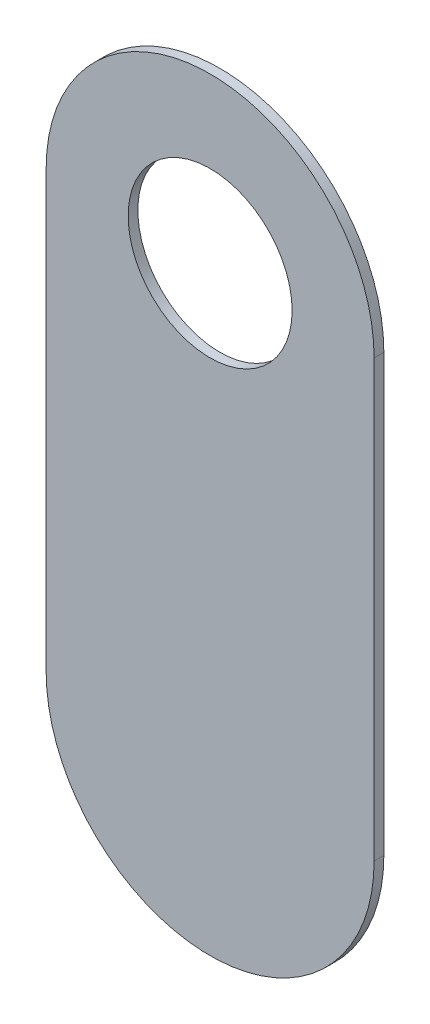
ISO-10303-21;
HEADER;
FILE_DESCRIPTION(('STEP AP214'),'2;1');
FILE_NAME('part.step','',(''),(''),'','','');
FILE_SCHEMA(('AUTOMOTIVE_DESIGN { 1 0 10303 214 1 1 1 1 }'));
ENDSEC;
DATA;
#1=APPLICATION_CONTEXT('core data for automotive mechanical design processes');
#2=APPLICATION_PROTOCOL_DEFINITION('international standard','automotive_design',2000,#1);
#3=PRODUCT_CONTEXT('',#1,'mechanical');
#4=PRODUCT('Part','Part','',(#3));
#5=PRODUCT_RELATED_PRODUCT_CATEGORY('part','',(#4));
#6=PRODUCT_DEFINITION_FORMATION('','',#4);
#7=PRODUCT_DEFINITION_CONTEXT('part definition',#1,'design');
#8=PRODUCT_DEFINITION('design','',#6,#7);
#9=PRODUCT_DEFINITION_SHAPE('','',#8);
#10=(LENGTH_UNIT() NAMED_UNIT(*) SI_UNIT(.MILLI.,.METRE.));
#11=(NAMED_UNIT(*) PLANE_ANGLE_UNIT() SI_UNIT($,.RADIAN.));
#12=(NAMED_UNIT(*) SI_UNIT($,.STERADIAN.) SOLID_ANGLE_UNIT());
#13=UNCERTAINTY_MEASURE_WITH_UNIT(LENGTH_MEASURE(1.E-05),#10,'distance_accuracy_value','');
#14=(GEOMETRIC_REPRESENTATION_CONTEXT(3) GLOBAL_UNCERTAINTY_ASSIGNED_CONTEXT((#13)) GLOBAL_UNIT_ASSIGNED_CONTEXT((#10,
#11,#12)) REPRESENTATION_CONTEXT('',''));
#15=CARTESIAN_POINT('',(0.,0.,0.));
#16=DIRECTION('',(0.,0.,1.));
#17=DIRECTION('',(1.,0.,0.));
#18=AXIS2_PLACEMENT_3D('',#15,#16,#17);
#19=CARTESIAN_POINT('',(55.500016,76.9058152,0.));
#20=DIRECTION('',(-1.,0.,0.));
#21=DIRECTION('',(0.,1.,0.));
#22=AXIS2_PLACEMENT_3D('',#19,#20,#21);
#23=PLANE('',#22);
#24=DIRECTION('',(0.,1.,0.));
#25=VECTOR('',#24,1.);
#26=CARTESIAN_POINT('',(55.500016,76.9058152,0.03556));
#27=LINE('',#26,#25);
#28=CARTESIAN_POINT('',(55.500016,76.9058152,0.03556));
#29=VERTEX_POINT('',#28);
#30=CARTESIAN_POINT('',(55.500016,78.5000208,0.03556));
#31=VERTEX_POINT('',#30);
#32=EDGE_CURVE('E11',#29,#31,#27,.T.);
#33=ORIENTED_EDGE('',*,*,#32,.F.);
#34=DIRECTION('',(0.,0.,1.));
#35=VECTOR('',#34,1.);
#36=CARTESIAN_POINT('',(55.500016,76.9058152,0.));
#37=LINE('',#36,#35);
#38=CARTESIAN_POINT('',(55.500016,76.9058152,0.));
#39=VERTEX_POINT('',#38);
#40=EDGE_CURVE('E24',#39,#29,#37,.T.);
#41=ORIENTED_EDGE('',*,*,#40,.F.);
#42=DIRECTION('',(0.,1.,0.));
#43=VECTOR('',#42,1.);
#44=CARTESIAN_POINT('',(55.500016,76.9058152,0.));
#45=LINE('',#44,#43);
#46=CARTESIAN_POINT('',(55.500016,78.5000208,0.));
#47=VERTEX_POINT('',#46);
#48=EDGE_CURVE('E96',#39,#47,#45,.T.);
#49=ORIENTED_EDGE('',*,*,#48,.T.);
#50=DIRECTION('',(0.,0.,1.));
#51=VECTOR('',#50,1.);
#52=CARTESIAN_POINT('',(55.500016,78.5000208,0.));
#53=LINE('',#52,#51);
#54=EDGE_CURVE('E37',#47,#31,#53,.T.);
#55=ORIENTED_EDGE('',*,*,#54,.T.);
#56=EDGE_LOOP('',(#33,#41,#49,#55));
#57=FACE_BOUND('',#56,.T.);
#58=ADVANCED_FACE('F17',(#57),#23,.F.);
#59=CARTESIAN_POINT('',(54.9000172,76.9058152,0.));
#60=DIRECTION('',(0.,0.,-1.));
#61=DIRECTION('',(-1.,0.,0.));
#62=AXIS2_PLACEMENT_3D('',#59,#60,#61);
#63=CYLINDRICAL_SURFACE('',#62,0.599998799999999);
#64=CARTESIAN_POINT('',(54.9000172,76.9058152,0.03556));
#65=DIRECTION('',(0.,0.,1.));
#66=DIRECTION('',(-1.,0.,0.));
#67=AXIS2_PLACEMENT_3D('',#64,#65,#66);
#68=CIRCLE('',#67,0.599998799999999);
#69=CARTESIAN_POINT('',(54.3000184,76.9058152,0.03556));
#70=VERTEX_POINT('',#69);
#71=EDGE_CURVE('E92',#70,#29,#68,.T.);
#72=ORIENTED_EDGE('',*,*,#71,.F.);
#73=DIRECTION('',(0.,0.,1.));
#74=VECTOR('',#73,1.);
#75=CARTESIAN_POINT('',(54.3000184,76.9058152,0.));
#76=LINE('',#75,#74);
#77=CARTESIAN_POINT('',(54.3000184,76.9058152,0.));
#78=VERTEX_POINT('',#77);
#79=EDGE_CURVE('E90',#78,#70,#76,.T.);
#80=ORIENTED_EDGE('',*,*,#79,.F.);
#81=CARTESIAN_POINT('',(54.9000172,76.9058152,0.));
#82=DIRECTION('',(0.,0.,1.));
#83=DIRECTION('',(-1.,0.,0.));
#84=AXIS2_PLACEMENT_3D('',#81,#82,#83);
#85=CIRCLE('',#84,0.599998799999999);
#86=EDGE_CURVE('E88',#78,#39,#85,.T.);
#87=ORIENTED_EDGE('',*,*,#86,.T.);
#88=ORIENTED_EDGE('',*,*,#40,.T.);
#89=EDGE_LOOP('',(#72,#80,#87,#88));
#90=FACE_BOUND('',#89,.T.);
#91=ADVANCED_FACE('F111',(#90),#63,.T.);
#92=CARTESIAN_POINT('',(54.9000172,78.5000208,0.));
#93=DIRECTION('',(0.,0.,-1.));
#94=DIRECTION('',(1.,0.,0.));
#95=AXIS2_PLACEMENT_3D('',#92,#93,#94);
#96=CYLINDRICAL_SURFACE('',#95,0.599998799999999);
#97=CARTESIAN_POINT('',(54.9000172,78.5000208,0.03556));
#98=DIRECTION('',(0.,0.,1.));
#99=DIRECTION('',(1.,0.,0.));
#100=AXIS2_PLACEMENT_3D('',#97,#98,#99);
#101=CIRCLE('',#100,0.599998799999999);
#102=CARTESIAN_POINT('',(54.3000184,78.5000208,0.03556));
#103=VERTEX_POINT('',#102);
#104=EDGE_CURVE('E85',#31,#103,#101,.T.);
#105=ORIENTED_EDGE('',*,*,#104,.F.);
#106=ORIENTED_EDGE('',*,*,#54,.F.);
#107=CARTESIAN_POINT('',(54.9000172,78.5000208,0.));
#108=DIRECTION('',(0.,0.,1.));
#109=DIRECTION('',(1.,0.,0.));
#110=AXIS2_PLACEMENT_3D('',#107,#108,#109);
#111=CIRCLE('',#110,0.599998799999999);
#112=CARTESIAN_POINT('',(54.3000184,78.5000208,0.));
#113=VERTEX_POINT('',#112);
#114=EDGE_CURVE('E82',#47,#113,#111,.T.);
#115=ORIENTED_EDGE('',*,*,#114,.T.);
#116=DIRECTION('',(0.,0.,1.));
#117=VECTOR('',#116,1.);
#118=CARTESIAN_POINT('',(54.3000184,78.5000208,0.));
#119=LINE('',#118,#117);
#120=EDGE_CURVE('E80',#113,#103,#119,.T.);
#121=ORIENTED_EDGE('',*,*,#120,.T.);
#122=EDGE_LOOP('',(#105,#106,#115,#121));
#123=FACE_BOUND('',#122,.T.);
#124=ADVANCED_FACE('F104',(#123),#96,.T.);
#125=CARTESIAN_POINT('',(54.3000184,78.5000208,0.));
#126=DIRECTION('',(1.,0.,0.));
#127=DIRECTION('',(0.,-1.,0.));
#128=AXIS2_PLACEMENT_3D('',#125,#126,#127);
#129=PLANE('',#128);
#130=DIRECTION('',(0.,-1.,0.));
#131=VECTOR('',#130,1.);
#132=CARTESIAN_POINT('',(54.3000184,78.5000208,0.03556));
#133=LINE('',#132,#131);
#134=EDGE_CURVE('E77',#103,#70,#133,.T.);
#135=ORIENTED_EDGE('',*,*,#134,.F.);
#136=ORIENTED_EDGE('',*,*,#120,.F.);
#137=DIRECTION('',(0.,-1.,0.));
#138=VECTOR('',#137,1.);
#139=CARTESIAN_POINT('',(54.3000184,78.5000208,0.));
#140=LINE('',#139,#138);
#141=EDGE_CURVE('E68',#113,#78,#140,.T.);
#142=ORIENTED_EDGE('',*,*,#141,.T.);
#143=ORIENTED_EDGE('',*,*,#79,.T.);
#144=EDGE_LOOP('',(#135,#136,#142,#143));
#145=FACE_BOUND('',#144,.T.);
#146=ADVANCED_FACE('F110',(#145),#129,.F.);
#147=CARTESIAN_POINT('',(54.9000172,78.5000208,0.));
#148=DIRECTION('',(0.,0.,-1.));
#149=DIRECTION('',(1.,0.,0.));
#150=AXIS2_PLACEMENT_3D('',#147,#148,#149);
#151=CYLINDRICAL_SURFACE('',#150,0.2999994);
#152=DIRECTION('',(0.,0.,1.));
#153=VECTOR('',#152,1.);
#154=CARTESIAN_POINT('',(55.2000166,78.5000208,0.));
#155=LINE('',#154,#153);
#156=CARTESIAN_POINT('',(55.2000166,78.5000208,0.));
#157=VERTEX_POINT('',#156);
#158=CARTESIAN_POINT('',(55.2000166,78.5000208,0.03556));
#159=VERTEX_POINT('',#158);
#160=EDGE_CURVE('E62',#157,#159,#155,.T.);
#161=ORIENTED_EDGE('',*,*,#160,.T.);
#162=CARTESIAN_POINT('',(54.9000172,78.5000208,0.03556));
#163=DIRECTION('',(0.,0.,1.));
#164=DIRECTION('',(1.,0.,0.));
#165=AXIS2_PLACEMENT_3D('',#162,#163,#164);
#166=CIRCLE('',#165,0.2999994);
#167=EDGE_CURVE('E67',#159,#159,#166,.T.);
#168=ORIENTED_EDGE('',*,*,#167,.T.);
#169=ORIENTED_EDGE('',*,*,#160,.F.);
#170=CARTESIAN_POINT('',(54.9000172,78.5000208,0.));
#171=DIRECTION('',(0.,0.,1.));
#172=DIRECTION('',(1.,0.,0.));
#173=AXIS2_PLACEMENT_3D('',#170,#171,#172);
#174=CIRCLE('',#173,0.2999994);
#175=EDGE_CURVE('E65',#157,#157,#174,.T.);
#176=ORIENTED_EDGE('',*,*,#175,.F.);
#177=EDGE_LOOP('',(#161,#168,#169,#176));
#178=FACE_BOUND('',#177,.T.);
#179=ADVANCED_FACE('F64',(#178),#151,.F.);
#180=CARTESIAN_POINT('',(55.500016,76.9058152,0.));
#181=DIRECTION('',(0.,0.,-1.));
#182=DIRECTION('',(-1.,0.,0.));
#183=AXIS2_PLACEMENT_3D('',#180,#181,#182);
#184=PLANE('',#183);
#185=ORIENTED_EDGE('',*,*,#48,.F.);
#186=ORIENTED_EDGE('',*,*,#86,.F.);
#187=ORIENTED_EDGE('',*,*,#141,.F.);
#188=ORIENTED_EDGE('',*,*,#114,.F.);
#189=EDGE_LOOP('',(#185,#186,#187,#188));
#190=FACE_BOUND('',#189,.T.);
#191=ORIENTED_EDGE('',*,*,#175,.T.);
#192=EDGE_LOOP('',(#191));
#193=FACE_BOUND('',#192,.T.);
#194=ADVANCED_FACE('F71',(#190,#193),#184,.T.);
#195=CARTESIAN_POINT('',(55.500016,76.9058152,0.03556));
#196=DIRECTION('',(0.,0.,-1.));
#197=DIRECTION('',(-1.,0.,0.));
#198=AXIS2_PLACEMENT_3D('',#195,#196,#197);
#199=PLANE('',#198);
#200=ORIENTED_EDGE('',*,*,#134,.T.);
#201=ORIENTED_EDGE('',*,*,#71,.T.);
#202=ORIENTED_EDGE('',*,*,#32,.T.);
#203=ORIENTED_EDGE('',*,*,#104,.T.);
#204=EDGE_LOOP('',(#200,#201,#202,#203));
#205=FACE_BOUND('',#204,.T.);
#206=ORIENTED_EDGE('',*,*,#167,.F.);
#207=EDGE_LOOP('',(#206));
#208=FACE_BOUND('',#207,.T.);
#209=ADVANCED_FACE('F107',(#205,#208),#199,.F.);
#210=CLOSED_SHELL('',(#58,#91,#124,#146,#179,#194,#209));
#211=MANIFOLD_SOLID_BREP('B1',#210);
#212=ADVANCED_BREP_SHAPE_REPRESENTATION('',(#18,#211),#14);
#213=SHAPE_DEFINITION_REPRESENTATION(#9,#212);
ENDSEC;
END-ISO-10303-21;
